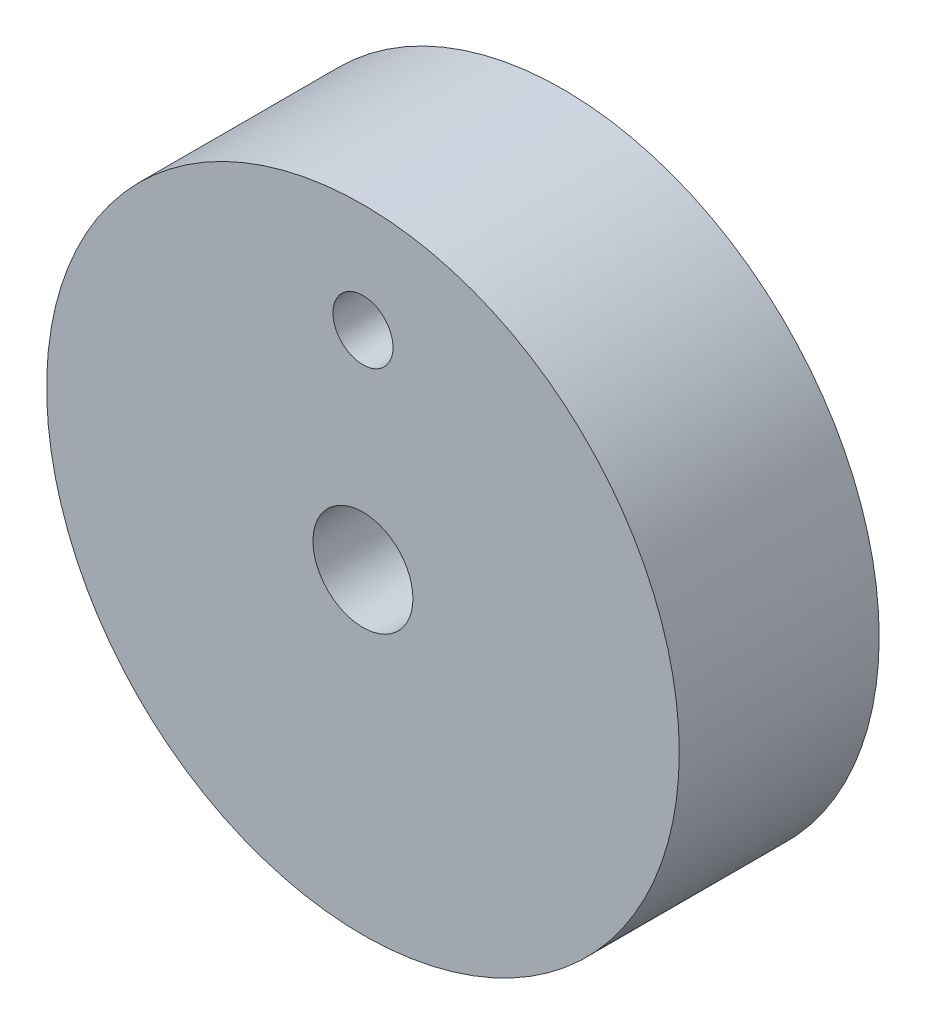
ISO-10303-21;
HEADER;
FILE_DESCRIPTION(('STEP AP214'),'2;1');
FILE_NAME('part.step','',(''),(''),'','','');
FILE_SCHEMA(('AUTOMOTIVE_DESIGN { 1 0 10303 214 1 1 1 1 }'));
ENDSEC;
DATA;
#1=APPLICATION_CONTEXT('core data for automotive mechanical design processes');
#2=APPLICATION_PROTOCOL_DEFINITION('international standard','automotive_design',2000,#1);
#3=PRODUCT_CONTEXT('',#1,'mechanical');
#4=PRODUCT('Part','Part','',(#3));
#5=PRODUCT_RELATED_PRODUCT_CATEGORY('part','',(#4));
#6=PRODUCT_DEFINITION_FORMATION('','',#4);
#7=PRODUCT_DEFINITION_CONTEXT('part definition',#1,'design');
#8=PRODUCT_DEFINITION('design','',#6,#7);
#9=PRODUCT_DEFINITION_SHAPE('','',#8);
#10=(LENGTH_UNIT() NAMED_UNIT(*) SI_UNIT(.MILLI.,.METRE.));
#11=(NAMED_UNIT(*) PLANE_ANGLE_UNIT() SI_UNIT($,.RADIAN.));
#12=(NAMED_UNIT(*) SI_UNIT($,.STERADIAN.) SOLID_ANGLE_UNIT());
#13=UNCERTAINTY_MEASURE_WITH_UNIT(LENGTH_MEASURE(1.E-05),#10,'distance_accuracy_value','');
#14=(GEOMETRIC_REPRESENTATION_CONTEXT(3) GLOBAL_UNCERTAINTY_ASSIGNED_CONTEXT((#13)) GLOBAL_UNIT_ASSIGNED_CONTEXT((#10,
#11,#12)) REPRESENTATION_CONTEXT('',''));
#15=CARTESIAN_POINT('',(0.,0.,0.));
#16=DIRECTION('',(0.,0.,1.));
#17=DIRECTION('',(1.,0.,0.));
#18=AXIS2_PLACEMENT_3D('',#15,#16,#17);
#19=CARTESIAN_POINT('',(0.,0.,200.66));
#20=DIRECTION('',(0.,0.,1.));
#21=DIRECTION('',(1.,0.,0.));
#22=AXIS2_PLACEMENT_3D('',#19,#20,#21);
#23=PLANE('',#22);
#24=CARTESIAN_POINT('',(0.,208.338633527276,200.66));
#25=DIRECTION('',(0.,0.,1.));
#26=DIRECTION('',(1.,0.,0.));
#27=AXIS2_PLACEMENT_3D('',#24,#25,#26);
#28=CIRCLE('',#27,30.1254769556874);
#29=CARTESIAN_POINT('',(30.1254769556874,208.338633527276,200.66));
#30=VERTEX_POINT('',#29);
#31=EDGE_CURVE('E51',#30,#30,#28,.T.);
#32=ORIENTED_EDGE('',*,*,#31,.F.);
#33=EDGE_LOOP('',(#32));
#34=FACE_BOUND('',#33,.T.);
#35=CARTESIAN_POINT('',(0.,0.,200.66));
#36=DIRECTION('',(0.,0.,1.));
#37=DIRECTION('',(1.,0.,0.));
#38=AXIS2_PLACEMENT_3D('',#35,#36,#37);
#39=CIRCLE('',#38,317.5);
#40=CARTESIAN_POINT('',(317.5,0.,200.66));
#41=VERTEX_POINT('',#40);
#42=EDGE_CURVE('E10',#41,#41,#39,.T.);
#43=ORIENTED_EDGE('',*,*,#42,.T.);
#44=EDGE_LOOP('',(#43));
#45=FACE_BOUND('',#44,.T.);
#46=CARTESIAN_POINT('',(0.,0.,200.66));
#47=DIRECTION('',(0.,0.,1.));
#48=DIRECTION('',(1.,0.,0.));
#49=AXIS2_PLACEMENT_3D('',#46,#47,#48);
#50=CIRCLE('',#49,50.165);
#51=CARTESIAN_POINT('',(50.165,0.,200.66));
#52=VERTEX_POINT('',#51);
#53=EDGE_CURVE('E44',#52,#52,#50,.T.);
#54=ORIENTED_EDGE('',*,*,#53,.F.);
#55=EDGE_LOOP('',(#54));
#56=FACE_BOUND('',#55,.T.);
#57=ADVANCED_FACE('F31',(#34,#45,#56),#23,.T.);
#58=CARTESIAN_POINT('',(0.,0.,0.));
#59=DIRECTION('',(0.,0.,1.));
#60=DIRECTION('',(1.,0.,0.));
#61=AXIS2_PLACEMENT_3D('',#58,#59,#60);
#62=PLANE('',#61);
#63=CARTESIAN_POINT('',(0.,208.338633527276,0.));
#64=DIRECTION('',(0.,0.,1.));
#65=DIRECTION('',(1.,0.,0.));
#66=AXIS2_PLACEMENT_3D('',#63,#64,#65);
#67=CIRCLE('',#66,30.1254769556874);
#68=CARTESIAN_POINT('',(30.1254769556874,208.338633527276,0.));
#69=VERTEX_POINT('',#68);
#70=EDGE_CURVE('E35',#69,#69,#67,.T.);
#71=ORIENTED_EDGE('',*,*,#70,.T.);
#72=EDGE_LOOP('',(#71));
#73=FACE_BOUND('',#72,.T.);
#74=CARTESIAN_POINT('',(0.,0.,0.));
#75=DIRECTION('',(0.,0.,1.));
#76=DIRECTION('',(1.,0.,0.));
#77=AXIS2_PLACEMENT_3D('',#74,#75,#76);
#78=CIRCLE('',#77,317.5);
#79=CARTESIAN_POINT('',(317.5,0.,0.));
#80=VERTEX_POINT('',#79);
#81=EDGE_CURVE('E39',#80,#80,#78,.T.);
#82=ORIENTED_EDGE('',*,*,#81,.F.);
#83=EDGE_LOOP('',(#82));
#84=FACE_BOUND('',#83,.T.);
#85=CARTESIAN_POINT('',(0.,0.,0.));
#86=DIRECTION('',(0.,0.,1.));
#87=DIRECTION('',(1.,0.,0.));
#88=AXIS2_PLACEMENT_3D('',#85,#86,#87);
#89=CIRCLE('',#88,50.165);
#90=CARTESIAN_POINT('',(50.165,0.,0.));
#91=VERTEX_POINT('',#90);
#92=EDGE_CURVE('E46',#91,#91,#89,.T.);
#93=ORIENTED_EDGE('',*,*,#92,.T.);
#94=EDGE_LOOP('',(#93));
#95=FACE_BOUND('',#94,.T.);
#96=ADVANCED_FACE('F58',(#73,#84,#95),#62,.F.);
#97=CARTESIAN_POINT('',(0.,0.,200.66));
#98=DIRECTION('',(0.,0.,-1.));
#99=DIRECTION('',(-1.,0.,0.));
#100=AXIS2_PLACEMENT_3D('',#97,#98,#99);
#101=CYLINDRICAL_SURFACE('',#100,317.5);
#102=ORIENTED_EDGE('',*,*,#42,.F.);
#103=EDGE_LOOP('',(#102));
#104=FACE_BOUND('',#103,.T.);
#105=ORIENTED_EDGE('',*,*,#81,.T.);
#106=EDGE_LOOP('',(#105));
#107=FACE_BOUND('',#106,.T.);
#108=ADVANCED_FACE('F33',(#104,#107),#101,.T.);
#109=CARTESIAN_POINT('',(0.,0.,200.66));
#110=DIRECTION('',(0.,0.,-1.));
#111=DIRECTION('',(-1.,0.,0.));
#112=AXIS2_PLACEMENT_3D('',#109,#110,#111);
#113=CYLINDRICAL_SURFACE('',#112,50.165);
#114=ORIENTED_EDGE('',*,*,#53,.T.);
#115=EDGE_LOOP('',(#114));
#116=FACE_BOUND('',#115,.T.);
#117=ORIENTED_EDGE('',*,*,#92,.F.);
#118=EDGE_LOOP('',(#117));
#119=FACE_BOUND('',#118,.T.);
#120=ADVANCED_FACE('F63',(#116,#119),#113,.F.);
#121=CARTESIAN_POINT('',(0.,208.338633527276,-53.34));
#122=DIRECTION('',(0.,0.,1.));
#123=DIRECTION('',(1.,0.,0.));
#124=AXIS2_PLACEMENT_3D('',#121,#122,#123);
#125=CYLINDRICAL_SURFACE('',#124,30.1254769556874);
#126=ORIENTED_EDGE('',*,*,#31,.T.);
#127=EDGE_LOOP('',(#126));
#128=FACE_BOUND('',#127,.T.);
#129=ORIENTED_EDGE('',*,*,#70,.F.);
#130=EDGE_LOOP('',(#129));
#131=FACE_BOUND('',#130,.T.);
#132=ADVANCED_FACE('F61',(#128,#131),#125,.F.);
#133=CLOSED_SHELL('',(#57,#96,#108,#120,#132));
#134=MANIFOLD_SOLID_BREP('B2',#133);
#135=ADVANCED_BREP_SHAPE_REPRESENTATION('',(#18,#134),#14);
#136=SHAPE_DEFINITION_REPRESENTATION(#9,#135);
ENDSEC;
END-ISO-10303-21;
